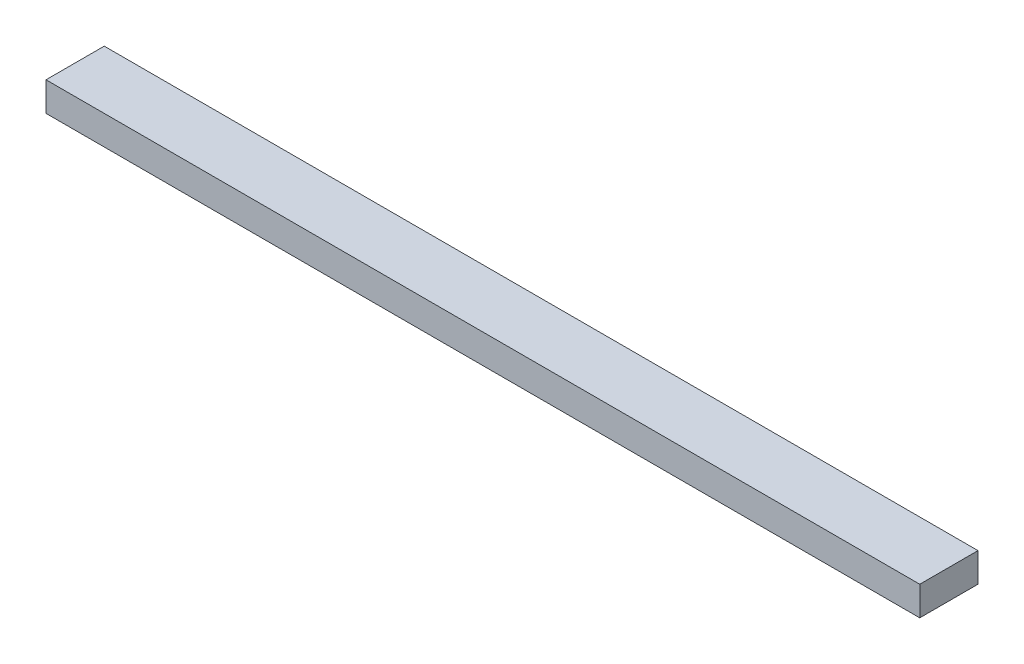
ISO-10303-21;
HEADER;
FILE_DESCRIPTION(('STEP AP214'),'2;1');
FILE_NAME('part.step','',(''),(''),'','','');
FILE_SCHEMA(('AUTOMOTIVE_DESIGN { 1 0 10303 214 1 1 1 1 }'));
ENDSEC;
DATA;
#1=APPLICATION_CONTEXT('core data for automotive mechanical design processes');
#2=APPLICATION_PROTOCOL_DEFINITION('international standard','automotive_design',2000,#1);
#3=PRODUCT_CONTEXT('',#1,'mechanical');
#4=PRODUCT('Part','Part','',(#3));
#5=PRODUCT_RELATED_PRODUCT_CATEGORY('part','',(#4));
#6=PRODUCT_DEFINITION_FORMATION('','',#4);
#7=PRODUCT_DEFINITION_CONTEXT('part definition',#1,'design');
#8=PRODUCT_DEFINITION('design','',#6,#7);
#9=PRODUCT_DEFINITION_SHAPE('','',#8);
#10=(LENGTH_UNIT() NAMED_UNIT(*) SI_UNIT(.MILLI.,.METRE.));
#11=(NAMED_UNIT(*) PLANE_ANGLE_UNIT() SI_UNIT($,.RADIAN.));
#12=(NAMED_UNIT(*) SI_UNIT($,.STERADIAN.) SOLID_ANGLE_UNIT());
#13=UNCERTAINTY_MEASURE_WITH_UNIT(LENGTH_MEASURE(1.E-05),#10,'distance_accuracy_value','');
#14=(GEOMETRIC_REPRESENTATION_CONTEXT(3) GLOBAL_UNCERTAINTY_ASSIGNED_CONTEXT((#13)) GLOBAL_UNIT_ASSIGNED_CONTEXT((#10,
#11,#12)) REPRESENTATION_CONTEXT('',''));
#15=CARTESIAN_POINT('',(0.,0.,0.));
#16=DIRECTION('',(0.,0.,1.));
#17=DIRECTION('',(1.,0.,0.));
#18=AXIS2_PLACEMENT_3D('',#15,#16,#17);
#19=CARTESIAN_POINT('',(761.999999999999,50.8,50.8));
#20=DIRECTION('',(-1.,0.,0.));
#21=DIRECTION('',(0.,0.,1.));
#22=AXIS2_PLACEMENT_3D('',#19,#20,#21);
#23=PLANE('',#22);
#24=DIRECTION('',(0.,0.,-1.));
#25=VECTOR('',#24,1.);
#26=CARTESIAN_POINT('',(761.999999999999,0.,50.8));
#27=LINE('',#26,#25);
#28=CARTESIAN_POINT('',(761.999999999999,0.,50.8));
#29=VERTEX_POINT('',#28);
#30=CARTESIAN_POINT('',(761.999999999999,0.,-50.8));
#31=VERTEX_POINT('',#30);
#32=EDGE_CURVE('E96',#29,#31,#27,.T.);
#33=ORIENTED_EDGE('',*,*,#32,.T.);
#34=DIRECTION('',(0.,-1.,0.));
#35=VECTOR('',#34,1.);
#36=CARTESIAN_POINT('',(761.999999999999,50.8,-50.8));
#37=LINE('',#36,#35);
#38=CARTESIAN_POINT('',(761.999999999999,50.8,-50.8));
#39=VERTEX_POINT('',#38);
#40=EDGE_CURVE('E11',#39,#31,#37,.T.);
#41=ORIENTED_EDGE('',*,*,#40,.F.);
#42=DIRECTION('',(0.,0.,-1.));
#43=VECTOR('',#42,1.);
#44=CARTESIAN_POINT('',(761.999999999999,50.8,50.8));
#45=LINE('',#44,#43);
#46=CARTESIAN_POINT('',(761.999999999999,50.8,50.8));
#47=VERTEX_POINT('',#46);
#48=EDGE_CURVE('E84',#47,#39,#45,.T.);
#49=ORIENTED_EDGE('',*,*,#48,.F.);
#50=DIRECTION('',(0.,-1.,0.));
#51=VECTOR('',#50,1.);
#52=CARTESIAN_POINT('',(761.999999999999,50.8,50.8));
#53=LINE('',#52,#51);
#54=EDGE_CURVE('E92',#47,#29,#53,.T.);
#55=ORIENTED_EDGE('',*,*,#54,.T.);
#56=EDGE_LOOP('',(#33,#41,#49,#55));
#57=FACE_BOUND('',#56,.T.);
#58=ADVANCED_FACE('F33',(#57),#23,.F.);
#59=CARTESIAN_POINT('',(-762.000000000001,50.8,-50.8));
#60=DIRECTION('',(0.,0.,1.));
#61=DIRECTION('',(1.,0.,0.));
#62=AXIS2_PLACEMENT_3D('',#59,#60,#61);
#63=PLANE('',#62);
#64=DIRECTION('',(-1.,0.,0.));
#65=VECTOR('',#64,1.);
#66=CARTESIAN_POINT('',(-762.000000000001,0.,-50.8));
#67=LINE('',#66,#65);
#68=CARTESIAN_POINT('',(-762.000000000001,0.,-50.8));
#69=VERTEX_POINT('',#68);
#70=EDGE_CURVE('E88',#31,#69,#67,.T.);
#71=ORIENTED_EDGE('',*,*,#70,.T.);
#72=DIRECTION('',(0.,-1.,0.));
#73=VECTOR('',#72,1.);
#74=CARTESIAN_POINT('',(-762.000000000001,50.8,-50.8));
#75=LINE('',#74,#73);
#76=CARTESIAN_POINT('',(-762.000000000001,50.8,-50.8));
#77=VERTEX_POINT('',#76);
#78=EDGE_CURVE('E41',#77,#69,#75,.T.);
#79=ORIENTED_EDGE('',*,*,#78,.F.);
#80=DIRECTION('',(-1.,0.,0.));
#81=VECTOR('',#80,1.);
#82=CARTESIAN_POINT('',(-762.000000000001,50.8,-50.8));
#83=LINE('',#82,#81);
#84=EDGE_CURVE('E79',#39,#77,#83,.T.);
#85=ORIENTED_EDGE('',*,*,#84,.F.);
#86=ORIENTED_EDGE('',*,*,#40,.T.);
#87=EDGE_LOOP('',(#71,#79,#85,#86));
#88=FACE_BOUND('',#87,.T.);
#89=ADVANCED_FACE('F87',(#88),#63,.F.);
#90=CARTESIAN_POINT('',(-762.000000000001,50.8,50.8));
#91=DIRECTION('',(1.,0.,0.));
#92=DIRECTION('',(0.,0.,-1.));
#93=AXIS2_PLACEMENT_3D('',#90,#91,#92);
#94=PLANE('',#93);
#95=DIRECTION('',(0.,0.,1.));
#96=VECTOR('',#95,1.);
#97=CARTESIAN_POINT('',(-762.000000000001,0.,50.8));
#98=LINE('',#97,#96);
#99=CARTESIAN_POINT('',(-762.000000000001,0.,50.8));
#100=VERTEX_POINT('',#99);
#101=EDGE_CURVE('E66',#69,#100,#98,.T.);
#102=ORIENTED_EDGE('',*,*,#101,.T.);
#103=DIRECTION('',(0.,-1.,0.));
#104=VECTOR('',#103,1.);
#105=CARTESIAN_POINT('',(-762.000000000001,50.8,50.8));
#106=LINE('',#105,#104);
#107=CARTESIAN_POINT('',(-762.000000000001,50.8,50.8));
#108=VERTEX_POINT('',#107);
#109=EDGE_CURVE('E89',#108,#100,#106,.T.);
#110=ORIENTED_EDGE('',*,*,#109,.F.);
#111=DIRECTION('',(0.,0.,1.));
#112=VECTOR('',#111,1.);
#113=CARTESIAN_POINT('',(-762.000000000001,50.8,50.8));
#114=LINE('',#113,#112);
#115=EDGE_CURVE('E82',#77,#108,#114,.T.);
#116=ORIENTED_EDGE('',*,*,#115,.F.);
#117=ORIENTED_EDGE('',*,*,#78,.T.);
#118=EDGE_LOOP('',(#102,#110,#116,#117));
#119=FACE_BOUND('',#118,.T.);
#120=ADVANCED_FACE('F90',(#119),#94,.F.);
#121=CARTESIAN_POINT('',(-762.000000000001,50.8,50.8));
#122=DIRECTION('',(0.,0.,-1.));
#123=DIRECTION('',(-1.,0.,0.));
#124=AXIS2_PLACEMENT_3D('',#121,#122,#123);
#125=PLANE('',#124);
#126=DIRECTION('',(1.,0.,0.));
#127=VECTOR('',#126,1.);
#128=CARTESIAN_POINT('',(-762.000000000001,0.,50.8));
#129=LINE('',#128,#127);
#130=EDGE_CURVE('E72',#100,#29,#129,.T.);
#131=ORIENTED_EDGE('',*,*,#130,.T.);
#132=ORIENTED_EDGE('',*,*,#54,.F.);
#133=DIRECTION('',(1.,0.,0.));
#134=VECTOR('',#133,1.);
#135=CARTESIAN_POINT('',(-762.000000000001,50.8,50.8));
#136=LINE('',#135,#134);
#137=EDGE_CURVE('E49',#108,#47,#136,.T.);
#138=ORIENTED_EDGE('',*,*,#137,.F.);
#139=ORIENTED_EDGE('',*,*,#109,.T.);
#140=EDGE_LOOP('',(#131,#132,#138,#139));
#141=FACE_BOUND('',#140,.T.);
#142=ADVANCED_FACE('F103',(#141),#125,.F.);
#143=CARTESIAN_POINT('',(0.,50.8,0.));
#144=DIRECTION('',(0.,-1.,0.));
#145=DIRECTION('',(0.,0.,-1.));
#146=AXIS2_PLACEMENT_3D('',#143,#144,#145);
#147=PLANE('',#146);
#148=ORIENTED_EDGE('',*,*,#48,.T.);
#149=ORIENTED_EDGE('',*,*,#84,.T.);
#150=ORIENTED_EDGE('',*,*,#115,.T.);
#151=ORIENTED_EDGE('',*,*,#137,.T.);
#152=EDGE_LOOP('',(#148,#149,#150,#151));
#153=FACE_BOUND('',#152,.T.);
#154=ADVANCED_FACE('F80',(#153),#147,.F.);
#155=CARTESIAN_POINT('',(0.,0.,0.));
#156=DIRECTION('',(0.,-1.,0.));
#157=DIRECTION('',(0.,0.,-1.));
#158=AXIS2_PLACEMENT_3D('',#155,#156,#157);
#159=PLANE('',#158);
#160=ORIENTED_EDGE('',*,*,#32,.F.);
#161=ORIENTED_EDGE('',*,*,#130,.F.);
#162=ORIENTED_EDGE('',*,*,#101,.F.);
#163=ORIENTED_EDGE('',*,*,#70,.F.);
#164=EDGE_LOOP('',(#160,#161,#162,#163));
#165=FACE_BOUND('',#164,.T.);
#166=ADVANCED_FACE('F106',(#165),#159,.T.);
#167=CLOSED_SHELL('',(#58,#89,#120,#142,#154,#166));
#168=MANIFOLD_SOLID_BREP('B2',#167);
#169=ADVANCED_BREP_SHAPE_REPRESENTATION('',(#18,#168),#14);
#170=SHAPE_DEFINITION_REPRESENTATION(#9,#169);
ENDSEC;
END-ISO-10303-21;
